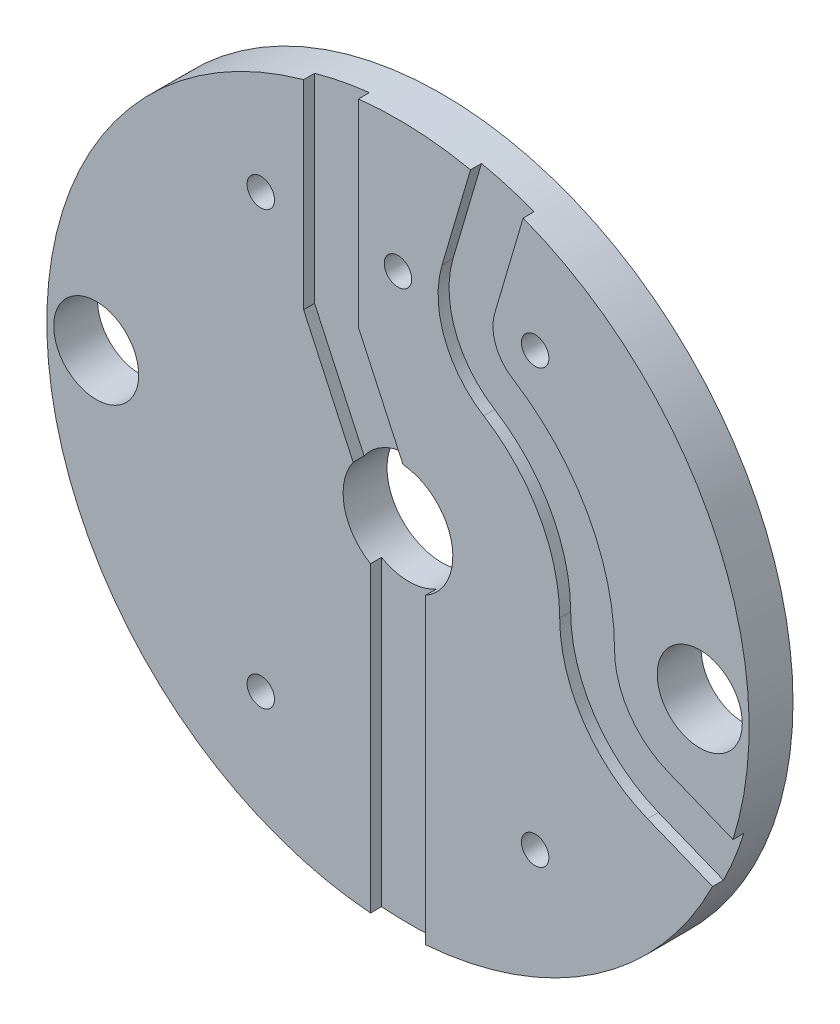
ISO-10303-21;
HEADER;
FILE_DESCRIPTION(('STEP AP214'),'2;1');
FILE_NAME('part.step','',(''),(''),'','','');
FILE_SCHEMA(('AUTOMOTIVE_DESIGN { 1 0 10303 214 1 1 1 1 }'));
ENDSEC;
DATA;
#1=APPLICATION_CONTEXT('core data for automotive mechanical design processes');
#2=APPLICATION_PROTOCOL_DEFINITION('international standard','automotive_design',2000,#1);
#3=PRODUCT_CONTEXT('',#1,'mechanical');
#4=PRODUCT('Part','Part','',(#3));
#5=PRODUCT_RELATED_PRODUCT_CATEGORY('part','',(#4));
#6=PRODUCT_DEFINITION_FORMATION('','',#4);
#7=PRODUCT_DEFINITION_CONTEXT('part definition',#1,'design');
#8=PRODUCT_DEFINITION('design','',#6,#7);
#9=PRODUCT_DEFINITION_SHAPE('','',#8);
#10=(LENGTH_UNIT() NAMED_UNIT(*) SI_UNIT(.MILLI.,.METRE.));
#11=(NAMED_UNIT(*) PLANE_ANGLE_UNIT() SI_UNIT($,.RADIAN.));
#12=(NAMED_UNIT(*) SI_UNIT($,.STERADIAN.) SOLID_ANGLE_UNIT());
#13=UNCERTAINTY_MEASURE_WITH_UNIT(LENGTH_MEASURE(1.E-05),#10,'distance_accuracy_value','');
#14=(GEOMETRIC_REPRESENTATION_CONTEXT(3) GLOBAL_UNCERTAINTY_ASSIGNED_CONTEXT((#13)) GLOBAL_UNIT_ASSIGNED_CONTEXT((#10,
#11,#12)) REPRESENTATION_CONTEXT('',''));
#15=CARTESIAN_POINT('',(0.,0.,0.));
#16=DIRECTION('',(0.,0.,1.));
#17=DIRECTION('',(1.,0.,0.));
#18=AXIS2_PLACEMENT_3D('',#15,#16,#17);
#19=CARTESIAN_POINT('',(0.,0.,1.6));
#20=DIRECTION('',(0.,0.,1.));
#21=DIRECTION('',(1.,0.,0.));
#22=AXIS2_PLACEMENT_3D('',#19,#20,#21);
#23=PLANE('',#22);
#24=DIRECTION('',(0.,1.,0.));
#25=VECTOR('',#24,1.);
#26=CARTESIAN_POINT('',(-1.43983257770259,13.2237994701737,1.6));
#27=LINE('',#26,#25);
#28=CARTESIAN_POINT('',(-1.43983257770259,5.50594076223502,1.6));
#29=VERTEX_POINT('',#28);
#30=CARTESIAN_POINT('',(-1.43983257770259,12.7187610303907,1.6));
#31=VERTEX_POINT('',#30);
#32=EDGE_CURVE('E191',#29,#31,#27,.T.);
#33=ORIENTED_EDGE('',*,*,#32,.F.);
#34=DIRECTION('',(-0.419058177461746,0.907959384500452,0.));
#35=VECTOR('',#34,1.);
#36=CARTESIAN_POINT('',(-1.43983257770259,5.50594076223502,1.6));
#37=LINE('',#36,#35);
#38=CARTESIAN_POINT('',(0.182129329809493,1.99168996262549,1.6));
#39=VERTEX_POINT('',#38);
#40=EDGE_CURVE('E223',#39,#29,#37,.T.);
#41=ORIENTED_EDGE('',*,*,#40,.F.);
#42=CARTESIAN_POINT('',(0.,0.,1.6));
#43=DIRECTION('',(0.,0.,1.));
#44=DIRECTION('',(1.,0.,0.));
#45=AXIS2_PLACEMENT_3D('',#42,#43,#44);
#46=CIRCLE('',#45,2.);
#47=CARTESIAN_POINT('',(1.,-1.73205080756888,1.6));
#48=VERTEX_POINT('',#47);
#49=EDGE_CURVE('E351',#48,#39,#46,.T.);
#50=ORIENTED_EDGE('',*,*,#49,.F.);
#51=DIRECTION('',(0.,1.,0.));
#52=VECTOR('',#51,1.);
#53=CARTESIAN_POINT('',(1.,0.219636843879393,1.6));
#54=LINE('',#53,#52);
#55=CARTESIAN_POINT('',(1.,-12.7608777127594,1.6));
#56=VERTEX_POINT('',#55);
#57=EDGE_CURVE('E221',#56,#48,#54,.T.);
#58=ORIENTED_EDGE('',*,*,#57,.F.);
#59=CARTESIAN_POINT('',(0.,0.,1.6));
#60=DIRECTION('',(0.,0.,1.));
#61=DIRECTION('',(1.,0.,0.));
#62=AXIS2_PLACEMENT_3D('',#59,#60,#61);
#63=CIRCLE('',#62,12.8);
#64=CARTESIAN_POINT('',(11.4659173471551,-5.68970468374301,1.6));
#65=VERTEX_POINT('',#64);
#66=EDGE_CURVE('E360',#56,#65,#63,.T.);
#67=ORIENTED_EDGE('',*,*,#66,.T.);
#68=DIRECTION('',(0.927764122408426,-0.37316716518435,0.));
#69=VECTOR('',#68,1.);
#70=CARTESIAN_POINT('',(9.09504176992669,-4.73608630511631,1.6));
#71=LINE('',#70,#69);
#72=CARTESIAN_POINT('',(9.09504176992669,-4.73608630511631,1.6));
#73=VERTEX_POINT('',#72);
#74=EDGE_CURVE('E274',#73,#65,#71,.T.);
#75=ORIENTED_EDGE('',*,*,#74,.F.);
#76=CARTESIAN_POINT('',(11.,0.,1.6));
#77=DIRECTION('',(0.,0.,1.));
#78=DIRECTION('',(1.,0.,0.));
#79=AXIS2_PLACEMENT_3D('',#76,#77,#78);
#80=CIRCLE('',#79,5.10483881702785);
#81=CARTESIAN_POINT('',(5.89516118297215,0.,1.6));
#82=VERTEX_POINT('',#81);
#83=EDGE_CURVE('E271',#82,#73,#80,.T.);
#84=ORIENTED_EDGE('',*,*,#83,.F.);
#85=CARTESIAN_POINT('',(0.,0.,1.6));
#86=DIRECTION('',(0.,0.,-1.));
#87=DIRECTION('',(1.,0.,0.));
#88=AXIS2_PLACEMENT_3D('',#85,#86,#87);
#89=CIRCLE('',#88,5.89516118297215);
#90=CARTESIAN_POINT('',(3.12472232230531,4.99890345793041,1.6));
#91=VERTEX_POINT('',#90);
#92=EDGE_CURVE('E268',#91,#82,#89,.T.);
#93=ORIENTED_EDGE('',*,*,#92,.F.);
#94=CARTESIAN_POINT('',(5.,7.99895629484671,1.6));
#95=DIRECTION('',(0.,0.,1.));
#96=DIRECTION('',(1.,0.,0.));
#97=AXIS2_PLACEMENT_3D('',#94,#95,#96);
#98=CIRCLE('',#97,3.53793490510348);
#99=CARTESIAN_POINT('',(1.60603137440553,8.9979359549149,1.6));
#100=VERTEX_POINT('',#99);
#101=EDGE_CURVE('E236',#100,#91,#98,.T.);
#102=ORIENTED_EDGE('',*,*,#101,.F.);
#103=DIRECTION('',(-0.282362363034764,-0.959307821265638,0.));
#104=VECTOR('',#103,1.);
#105=CARTESIAN_POINT('',(1.60603137440553,8.9979359549149,1.6));
#106=LINE('',#105,#104);
#107=CARTESIAN_POINT('',(2.64388376410676,12.5239721590992,1.6));
#108=VERTEX_POINT('',#107);
#109=EDGE_CURVE('E241',#108,#100,#106,.T.);
#110=ORIENTED_EDGE('',*,*,#109,.F.);
#111=EDGE_CURVE('E362',#108,#31,#63,.T.);
#112=ORIENTED_EDGE('',*,*,#111,.T.);
#113=EDGE_LOOP('',(#33,#41,#50,#58,#67,#75,#84,#93,#102,#110,#112));
#114=FACE_BOUND('',#113,.T.);
#115=CARTESIAN_POINT('',(5.,-7.7651663405088,1.6));
#116=DIRECTION('',(0.,0.,1.));
#117=DIRECTION('',(1.,0.,0.));
#118=AXIS2_PLACEMENT_3D('',#115,#116,#117);
#119=CIRCLE('',#118,0.500000000000001);
#120=CARTESIAN_POINT('',(5.5,-7.7651663405088,1.6));
#121=VERTEX_POINT('',#120);
#122=EDGE_CURVE('E330',#121,#121,#119,.T.);
#123=ORIENTED_EDGE('',*,*,#122,.F.);
#124=EDGE_LOOP('',(#123));
#125=FACE_BOUND('',#124,.T.);
#126=CARTESIAN_POINT('',(0.,7.99895629484671,1.6));
#127=DIRECTION('',(0.,0.,1.));
#128=DIRECTION('',(1.,0.,0.));
#129=AXIS2_PLACEMENT_3D('',#126,#127,#128);
#130=CIRCLE('',#129,0.5);
#131=CARTESIAN_POINT('',(0.5,7.99895629484671,1.6));
#132=VERTEX_POINT('',#131);
#133=EDGE_CURVE('E318',#132,#132,#130,.T.);
#134=ORIENTED_EDGE('',*,*,#133,.F.);
#135=EDGE_LOOP('',(#134));
#136=FACE_BOUND('',#135,.T.);
#137=ADVANCED_FACE('F37',(#114,#125,#136),#23,.T.);
#138=DIRECTION('',(0.282362363034764,0.959307821265638,0.));
#139=VECTOR('',#138,1.);
#140=CARTESIAN_POINT('',(3.52464701693681,8.43321122884537,1.6));
#141=LINE('',#140,#139);
#142=CARTESIAN_POINT('',(3.52464701693681,8.43321122884537,1.6));
#143=VERTEX_POINT('',#142);
#144=CARTESIAN_POINT('',(4.56249940663803,11.9592474330297,1.6));
#145=VERTEX_POINT('',#144);
#146=EDGE_CURVE('E288',#143,#145,#141,.T.);
#147=ORIENTED_EDGE('',*,*,#146,.F.);
#148=CARTESIAN_POINT('',(5.,7.99895629484671,1.6));
#149=DIRECTION('',(0.,0.,-1.));
#150=DIRECTION('',(1.,0.,0.));
#151=AXIS2_PLACEMENT_3D('',#148,#149,#150);
#152=CIRCLE('',#151,1.53793490510348);
#153=CARTESIAN_POINT('',(4.18481965478568,6.69483790408922,1.6));
#154=VERTEX_POINT('',#153);
#155=EDGE_CURVE('E285',#154,#143,#152,.T.);
#156=ORIENTED_EDGE('',*,*,#155,.F.);
#157=CARTESIAN_POINT('',(0.,0.,1.6));
#158=DIRECTION('',(0.,0.,1.));
#159=DIRECTION('',(1.,0.,0.));
#160=AXIS2_PLACEMENT_3D('',#157,#158,#159);
#161=CIRCLE('',#160,7.89516118297215);
#162=CARTESIAN_POINT('',(7.89516118297215,0.,1.6));
#163=VERTEX_POINT('',#162);
#164=EDGE_CURVE('E282',#163,#154,#161,.T.);
#165=ORIENTED_EDGE('',*,*,#164,.F.);
#166=CARTESIAN_POINT('',(11.,0.,1.6));
#167=DIRECTION('',(0.,0.,-1.));
#168=DIRECTION('',(1.,0.,0.));
#169=AXIS2_PLACEMENT_3D('',#166,#167,#168);
#170=CIRCLE('',#169,3.10483881702785);
#171=CARTESIAN_POINT('',(9.84137610029539,-2.88055806029946,1.6));
#172=VERTEX_POINT('',#171);
#173=EDGE_CURVE('E279',#172,#163,#170,.T.);
#174=ORIENTED_EDGE('',*,*,#173,.F.);
#175=DIRECTION('',(-0.927764122408426,0.37316716518435,0.));
#176=VECTOR('',#175,1.);
#177=CARTESIAN_POINT('',(9.84137610029539,-2.88055806029946,1.6));
#178=LINE('',#177,#176);
#179=CARTESIAN_POINT('',(12.2122516775238,-3.83417643892615,1.6));
#180=VERTEX_POINT('',#179);
#181=EDGE_CURVE('E277',#180,#172,#178,.T.);
#182=ORIENTED_EDGE('',*,*,#181,.F.);
#183=EDGE_CURVE('E357',#180,#145,#63,.T.);
#184=ORIENTED_EDGE('',*,*,#183,.T.);
#185=EDGE_LOOP('',(#147,#156,#165,#174,#182,#184));
#186=FACE_BOUND('',#185,.T.);
#187=CARTESIAN_POINT('',(11.,0.,1.6));
#188=DIRECTION('',(0.,0.,1.));
#189=DIRECTION('',(1.,0.,0.));
#190=AXIS2_PLACEMENT_3D('',#187,#188,#189);
#191=CIRCLE('',#190,1.55);
#192=CARTESIAN_POINT('',(12.55,0.,1.6));
#193=VERTEX_POINT('',#192);
#194=EDGE_CURVE('E339',#193,#193,#191,.T.);
#195=ORIENTED_EDGE('',*,*,#194,.F.);
#196=EDGE_LOOP('',(#195));
#197=FACE_BOUND('',#196,.T.);
#198=CARTESIAN_POINT('',(5.,7.99895629484671,1.6));
#199=DIRECTION('',(0.,0.,1.));
#200=DIRECTION('',(1.,0.,0.));
#201=AXIS2_PLACEMENT_3D('',#198,#199,#200);
#202=CIRCLE('',#201,0.5);
#203=CARTESIAN_POINT('',(5.5,7.99895629484671,1.6));
#204=VERTEX_POINT('',#203);
#205=EDGE_CURVE('E312',#204,#204,#202,.T.);
#206=ORIENTED_EDGE('',*,*,#205,.F.);
#207=EDGE_LOOP('',(#206));
#208=FACE_BOUND('',#207,.T.);
#209=ADVANCED_FACE('F468',(#186,#197,#208),#23,.T.);
#210=DIRECTION('',(0.,-1.,0.));
#211=VECTOR('',#210,1.);
#212=CARTESIAN_POINT('',(-1.,-0.21963684387939,1.6));
#213=LINE('',#212,#211);
#214=CARTESIAN_POINT('',(-1.,-1.73205080756888,1.6));
#215=VERTEX_POINT('',#214);
#216=CARTESIAN_POINT('',(-1.,-12.7608777127594,1.6));
#217=VERTEX_POINT('',#216);
#218=EDGE_CURVE('E219',#215,#217,#213,.T.);
#219=ORIENTED_EDGE('',*,*,#218,.F.);
#220=CARTESIAN_POINT('',(-1.63378943919141,1.153573607702,1.6));
#221=VERTEX_POINT('',#220);
#222=EDGE_CURVE('E354',#221,#215,#46,.T.);
#223=ORIENTED_EDGE('',*,*,#222,.F.);
#224=DIRECTION('',(0.419058177461746,-0.907959384500452,0.));
#225=VECTOR('',#224,1.);
#226=CARTESIAN_POINT('',(-3.43983257770259,5.06666707447623,1.6));
#227=LINE('',#226,#225);
#228=CARTESIAN_POINT('',(-3.43983257770259,5.06666707447623,1.6));
#229=VERTEX_POINT('',#228);
#230=EDGE_CURVE('E217',#229,#221,#227,.T.);
#231=ORIENTED_EDGE('',*,*,#230,.F.);
#232=DIRECTION('',(0.,-1.,0.));
#233=VECTOR('',#232,1.);
#234=CARTESIAN_POINT('',(-3.43983257770259,13.2237994701737,1.6));
#235=LINE('',#234,#233);
#236=CARTESIAN_POINT('',(-3.43983257770259,12.3291342695818,1.6));
#237=VERTEX_POINT('',#236);
#238=EDGE_CURVE('E197',#237,#229,#235,.T.);
#239=ORIENTED_EDGE('',*,*,#238,.F.);
#240=EDGE_CURVE('E404',#237,#217,#63,.T.);
#241=ORIENTED_EDGE('',*,*,#240,.T.);
#242=EDGE_LOOP('',(#219,#223,#231,#239,#241));
#243=FACE_BOUND('',#242,.T.);
#244=CARTESIAN_POINT('',(-5.,7.99895629484671,1.6));
#245=DIRECTION('',(0.,0.,1.));
#246=DIRECTION('',(1.,0.,0.));
#247=AXIS2_PLACEMENT_3D('',#244,#245,#246);
#248=CIRCLE('',#247,0.5);
#249=CARTESIAN_POINT('',(-4.5,7.99895629484671,1.6));
#250=VERTEX_POINT('',#249);
#251=EDGE_CURVE('E294',#250,#250,#248,.T.);
#252=ORIENTED_EDGE('',*,*,#251,.F.);
#253=EDGE_LOOP('',(#252));
#254=FACE_BOUND('',#253,.T.);
#255=CARTESIAN_POINT('',(-5.,-7.7651663405088,1.6));
#256=DIRECTION('',(0.,0.,1.));
#257=DIRECTION('',(1.,0.,0.));
#258=AXIS2_PLACEMENT_3D('',#255,#256,#257);
#259=CIRCLE('',#258,0.500000000000001);
#260=CARTESIAN_POINT('',(-4.5,-7.7651663405088,1.6));
#261=VERTEX_POINT('',#260);
#262=EDGE_CURVE('E324',#261,#261,#259,.T.);
#263=ORIENTED_EDGE('',*,*,#262,.F.);
#264=EDGE_LOOP('',(#263));
#265=FACE_BOUND('',#264,.T.);
#266=CARTESIAN_POINT('',(-11.,0.,1.6));
#267=DIRECTION('',(0.,0.,1.));
#268=DIRECTION('',(1.,0.,0.));
#269=AXIS2_PLACEMENT_3D('',#266,#267,#268);
#270=CIRCLE('',#269,1.55);
#271=CARTESIAN_POINT('',(-9.45,0.,1.6));
#272=VERTEX_POINT('',#271);
#273=EDGE_CURVE('E345',#272,#272,#270,.T.);
#274=ORIENTED_EDGE('',*,*,#273,.F.);
#275=EDGE_LOOP('',(#274));
#276=FACE_BOUND('',#275,.T.);
#277=ADVANCED_FACE('F470',(#243,#254,#265,#276),#23,.T.);
#278=CARTESIAN_POINT('',(0.,0.,0.));
#279=DIRECTION('',(0.,0.,1.));
#280=DIRECTION('',(1.,0.,0.));
#281=AXIS2_PLACEMENT_3D('',#278,#279,#280);
#282=PLANE('',#281);
#283=CARTESIAN_POINT('',(-5.,7.99895629484671,0.));
#284=DIRECTION('',(0.,0.,1.));
#285=DIRECTION('',(1.,0.,0.));
#286=AXIS2_PLACEMENT_3D('',#283,#284,#285);
#287=CIRCLE('',#286,0.5);
#288=CARTESIAN_POINT('',(-4.5,7.99895629484671,0.));
#289=VERTEX_POINT('',#288);
#290=EDGE_CURVE('E309',#289,#289,#287,.T.);
#291=ORIENTED_EDGE('',*,*,#290,.T.);
#292=EDGE_LOOP('',(#291));
#293=FACE_BOUND('',#292,.T.);
#294=CARTESIAN_POINT('',(5.,7.99895629484671,0.));
#295=DIRECTION('',(0.,0.,1.));
#296=DIRECTION('',(1.,0.,0.));
#297=AXIS2_PLACEMENT_3D('',#294,#295,#296);
#298=CIRCLE('',#297,0.5);
#299=CARTESIAN_POINT('',(5.5,7.99895629484671,0.));
#300=VERTEX_POINT('',#299);
#301=EDGE_CURVE('E315',#300,#300,#298,.T.);
#302=ORIENTED_EDGE('',*,*,#301,.T.);
#303=EDGE_LOOP('',(#302));
#304=FACE_BOUND('',#303,.T.);
#305=CARTESIAN_POINT('',(0.,7.99895629484671,0.));
#306=DIRECTION('',(0.,0.,1.));
#307=DIRECTION('',(1.,0.,0.));
#308=AXIS2_PLACEMENT_3D('',#305,#306,#307);
#309=CIRCLE('',#308,0.5);
#310=CARTESIAN_POINT('',(0.5,7.99895629484671,0.));
#311=VERTEX_POINT('',#310);
#312=EDGE_CURVE('E321',#311,#311,#309,.T.);
#313=ORIENTED_EDGE('',*,*,#312,.T.);
#314=EDGE_LOOP('',(#313));
#315=FACE_BOUND('',#314,.T.);
#316=CARTESIAN_POINT('',(-5.,-7.7651663405088,0.));
#317=DIRECTION('',(0.,0.,1.));
#318=DIRECTION('',(1.,0.,0.));
#319=AXIS2_PLACEMENT_3D('',#316,#317,#318);
#320=CIRCLE('',#319,0.500000000000001);
#321=CARTESIAN_POINT('',(-4.5,-7.7651663405088,0.));
#322=VERTEX_POINT('',#321);
#323=EDGE_CURVE('E327',#322,#322,#320,.T.);
#324=ORIENTED_EDGE('',*,*,#323,.T.);
#325=EDGE_LOOP('',(#324));
#326=FACE_BOUND('',#325,.T.);
#327=CARTESIAN_POINT('',(5.,-7.7651663405088,0.));
#328=DIRECTION('',(0.,0.,1.));
#329=DIRECTION('',(1.,0.,0.));
#330=AXIS2_PLACEMENT_3D('',#327,#328,#329);
#331=CIRCLE('',#330,0.500000000000001);
#332=CARTESIAN_POINT('',(5.5,-7.7651663405088,0.));
#333=VERTEX_POINT('',#332);
#334=EDGE_CURVE('E333',#333,#333,#331,.T.);
#335=ORIENTED_EDGE('',*,*,#334,.T.);
#336=EDGE_LOOP('',(#335));
#337=FACE_BOUND('',#336,.T.);
#338=CARTESIAN_POINT('',(-11.,0.,0.));
#339=DIRECTION('',(0.,0.,1.));
#340=DIRECTION('',(1.,0.,0.));
#341=AXIS2_PLACEMENT_3D('',#338,#339,#340);
#342=CIRCLE('',#341,1.55);
#343=CARTESIAN_POINT('',(-9.45,0.,0.));
#344=VERTEX_POINT('',#343);
#345=EDGE_CURVE('E342',#344,#344,#342,.T.);
#346=ORIENTED_EDGE('',*,*,#345,.T.);
#347=EDGE_LOOP('',(#346));
#348=FACE_BOUND('',#347,.T.);
#349=CARTESIAN_POINT('',(0.,0.,0.));
#350=DIRECTION('',(0.,0.,1.));
#351=DIRECTION('',(1.,0.,0.));
#352=AXIS2_PLACEMENT_3D('',#349,#350,#351);
#353=CIRCLE('',#352,12.8);
#354=CARTESIAN_POINT('',(12.8,0.,0.));
#355=VERTEX_POINT('',#354);
#356=EDGE_CURVE('E361',#355,#355,#353,.T.);
#357=ORIENTED_EDGE('',*,*,#356,.F.);
#358=EDGE_LOOP('',(#357));
#359=FACE_BOUND('',#358,.T.);
#360=CARTESIAN_POINT('',(0.,0.,0.));
#361=DIRECTION('',(0.,0.,1.));
#362=DIRECTION('',(1.,0.,0.));
#363=AXIS2_PLACEMENT_3D('',#360,#361,#362);
#364=CIRCLE('',#363,2.);
#365=CARTESIAN_POINT('',(2.,0.,0.));
#366=VERTEX_POINT('',#365);
#367=EDGE_CURVE('E348',#366,#366,#364,.T.);
#368=ORIENTED_EDGE('',*,*,#367,.T.);
#369=EDGE_LOOP('',(#368));
#370=FACE_BOUND('',#369,.T.);
#371=CARTESIAN_POINT('',(11.,0.,0.));
#372=DIRECTION('',(0.,0.,1.));
#373=DIRECTION('',(1.,0.,0.));
#374=AXIS2_PLACEMENT_3D('',#371,#372,#373);
#375=CIRCLE('',#374,1.55);
#376=CARTESIAN_POINT('',(12.55,0.,0.));
#377=VERTEX_POINT('',#376);
#378=EDGE_CURVE('E336',#377,#377,#375,.T.);
#379=ORIENTED_EDGE('',*,*,#378,.T.);
#380=EDGE_LOOP('',(#379));
#381=FACE_BOUND('',#380,.T.);
#382=ADVANCED_FACE('F477',(#293,#304,#315,#326,#337,#348,#359,#370,#381),#282,.F.);
#383=CARTESIAN_POINT('',(0.,0.,1.6));
#384=DIRECTION('',(0.,0.,-1.));
#385=DIRECTION('',(-1.,0.,0.));
#386=AXIS2_PLACEMENT_3D('',#383,#384,#385);
#387=CYLINDRICAL_SURFACE('',#386,12.8);
#388=ORIENTED_EDGE('',*,*,#240,.F.);
#389=DIRECTION('',(0.,0.,-1.));
#390=VECTOR('',#389,1.);
#391=CARTESIAN_POINT('',(-3.43983257770259,12.3291342695818,1.6));
#392=LINE('',#391,#390);
#393=CARTESIAN_POINT('',(-3.43983257770259,12.3291342695818,1.2));
#394=VERTEX_POINT('',#393);
#395=EDGE_CURVE('E11',#237,#394,#392,.T.);
#396=ORIENTED_EDGE('',*,*,#395,.T.);
#397=CARTESIAN_POINT('',(0.,0.,1.2));
#398=DIRECTION('',(0.,0.,1.));
#399=DIRECTION('',(1.,0.,0.));
#400=AXIS2_PLACEMENT_3D('',#397,#398,#399);
#401=CIRCLE('',#400,12.8);
#402=CARTESIAN_POINT('',(-1.43983257770259,12.7187610303907,1.2));
#403=VERTEX_POINT('',#402);
#404=EDGE_CURVE('E189',#403,#394,#401,.T.);
#405=ORIENTED_EDGE('',*,*,#404,.F.);
#406=DIRECTION('',(0.,0.,-1.));
#407=VECTOR('',#406,1.);
#408=CARTESIAN_POINT('',(-1.43983257770259,12.7187610303907,1.6));
#409=LINE('',#408,#407);
#410=EDGE_CURVE('E45',#403,#31,#409,.F.);
#411=ORIENTED_EDGE('',*,*,#410,.T.);
#412=ORIENTED_EDGE('',*,*,#111,.F.);
#413=DIRECTION('',(0.,0.,-1.));
#414=VECTOR('',#413,1.);
#415=CARTESIAN_POINT('',(2.64388376410676,12.5239721590992,1.6));
#416=LINE('',#415,#414);
#417=CARTESIAN_POINT('',(2.64388376410676,12.5239721590992,1.2));
#418=VERTEX_POINT('',#417);
#419=EDGE_CURVE('E377',#108,#418,#416,.T.);
#420=ORIENTED_EDGE('',*,*,#419,.T.);
#421=CARTESIAN_POINT('',(0.,0.,1.2));
#422=DIRECTION('',(0.,0.,1.));
#423=DIRECTION('',(1.,0.,0.));
#424=AXIS2_PLACEMENT_3D('',#421,#422,#423);
#425=CIRCLE('',#424,12.8);
#426=CARTESIAN_POINT('',(4.56249940663803,11.9592474330297,1.2));
#427=VERTEX_POINT('',#426);
#428=EDGE_CURVE('E368',#427,#418,#425,.T.);
#429=ORIENTED_EDGE('',*,*,#428,.F.);
#430=DIRECTION('',(0.,0.,-1.));
#431=VECTOR('',#430,1.);
#432=CARTESIAN_POINT('',(4.56249940663803,11.9592474330297,1.6));
#433=LINE('',#432,#431);
#434=EDGE_CURVE('E374',#427,#145,#433,.F.);
#435=ORIENTED_EDGE('',*,*,#434,.T.);
#436=ORIENTED_EDGE('',*,*,#183,.F.);
#437=DIRECTION('',(0.,0.,-1.));
#438=VECTOR('',#437,1.);
#439=CARTESIAN_POINT('',(12.2122516775238,-3.83417643892615,1.6));
#440=LINE('',#439,#438);
#441=CARTESIAN_POINT('',(12.2122516775238,-3.83417643892615,1.2));
#442=VERTEX_POINT('',#441);
#443=EDGE_CURVE('E371',#180,#442,#440,.T.);
#444=ORIENTED_EDGE('',*,*,#443,.T.);
#445=CARTESIAN_POINT('',(11.4659173471551,-5.68970468374301,1.2));
#446=VERTEX_POINT('',#445);
#447=EDGE_CURVE('E365',#446,#442,#425,.T.);
#448=ORIENTED_EDGE('',*,*,#447,.F.);
#449=DIRECTION('',(0.,0.,-1.));
#450=VECTOR('',#449,1.);
#451=CARTESIAN_POINT('',(11.4659173471551,-5.68970468374301,1.6));
#452=LINE('',#451,#450);
#453=EDGE_CURVE('E367',#446,#65,#452,.F.);
#454=ORIENTED_EDGE('',*,*,#453,.T.);
#455=ORIENTED_EDGE('',*,*,#66,.F.);
#456=DIRECTION('',(0.,0.,-1.));
#457=VECTOR('',#456,1.);
#458=CARTESIAN_POINT('',(1.,-12.7608777127594,1.6));
#459=LINE('',#458,#457);
#460=CARTESIAN_POINT('',(1.,-12.7608777127594,1.2));
#461=VERTEX_POINT('',#460);
#462=EDGE_CURVE('E233',#56,#461,#459,.T.);
#463=ORIENTED_EDGE('',*,*,#462,.T.);
#464=CARTESIAN_POINT('',(-1.,-12.7608777127594,1.2));
#465=VERTEX_POINT('',#464);
#466=EDGE_CURVE('E227',#465,#461,#401,.T.);
#467=ORIENTED_EDGE('',*,*,#466,.F.);
#468=DIRECTION('',(0.,0.,-1.));
#469=VECTOR('',#468,1.);
#470=CARTESIAN_POINT('',(-1.,-12.7608777127594,1.6));
#471=LINE('',#470,#469);
#472=EDGE_CURVE('E230',#465,#217,#471,.F.);
#473=ORIENTED_EDGE('',*,*,#472,.T.);
#474=EDGE_LOOP('',(#388,#396,#405,#411,#412,#420,#429,#435,#436,#444,#448,#454,#455,#463,#467,#473));
#475=FACE_BOUND('',#474,.T.);
#476=ORIENTED_EDGE('',*,*,#356,.T.);
#477=EDGE_LOOP('',(#476));
#478=FACE_BOUND('',#477,.T.);
#479=ADVANCED_FACE('F39',(#475,#478),#387,.T.);
#480=CARTESIAN_POINT('',(0.,0.,1.6));
#481=DIRECTION('',(0.,0.,-1.));
#482=DIRECTION('',(-1.,0.,0.));
#483=AXIS2_PLACEMENT_3D('',#480,#481,#482);
#484=CYLINDRICAL_SURFACE('',#483,2.);
#485=DIRECTION('',(0.,0.,-1.));
#486=VECTOR('',#485,1.);
#487=CARTESIAN_POINT('',(0.182129329809493,1.99168996262549,1.6));
#488=LINE('',#487,#486);
#489=CARTESIAN_POINT('',(0.182129329809493,1.99168996262549,1.2));
#490=VERTEX_POINT('',#489);
#491=EDGE_CURVE('E389',#490,#39,#488,.F.);
#492=ORIENTED_EDGE('',*,*,#491,.F.);
#493=CARTESIAN_POINT('',(0.,0.,1.2));
#494=DIRECTION('',(0.,0.,1.));
#495=DIRECTION('',(1.,0.,0.));
#496=AXIS2_PLACEMENT_3D('',#493,#494,#495);
#497=CIRCLE('',#496,2.);
#498=CARTESIAN_POINT('',(-1.63378943919141,1.153573607702,1.2));
#499=VERTEX_POINT('',#498);
#500=EDGE_CURVE('E384',#490,#499,#497,.T.);
#501=ORIENTED_EDGE('',*,*,#500,.T.);
#502=DIRECTION('',(0.,0.,-1.));
#503=VECTOR('',#502,1.);
#504=CARTESIAN_POINT('',(-1.63378943919141,1.153573607702,1.6));
#505=LINE('',#504,#503);
#506=EDGE_CURVE('E205',#221,#499,#505,.T.);
#507=ORIENTED_EDGE('',*,*,#506,.F.);
#508=ORIENTED_EDGE('',*,*,#222,.T.);
#509=DIRECTION('',(0.,0.,-1.));
#510=VECTOR('',#509,1.);
#511=CARTESIAN_POINT('',(-1.,-1.73205080756888,1.6));
#512=LINE('',#511,#510);
#513=CARTESIAN_POINT('',(-1.,-1.73205080756888,1.2));
#514=VERTEX_POINT('',#513);
#515=EDGE_CURVE('E383',#514,#215,#512,.F.);
#516=ORIENTED_EDGE('',*,*,#515,.F.);
#517=CARTESIAN_POINT('',(1.,-1.73205080756888,1.2));
#518=VERTEX_POINT('',#517);
#519=EDGE_CURVE('E380',#514,#518,#497,.T.);
#520=ORIENTED_EDGE('',*,*,#519,.T.);
#521=DIRECTION('',(0.,0.,-1.));
#522=VECTOR('',#521,1.);
#523=CARTESIAN_POINT('',(1.,-1.73205080756888,1.6));
#524=LINE('',#523,#522);
#525=EDGE_CURVE('E386',#48,#518,#524,.T.);
#526=ORIENTED_EDGE('',*,*,#525,.F.);
#527=ORIENTED_EDGE('',*,*,#49,.T.);
#528=EDGE_LOOP('',(#492,#501,#507,#508,#516,#520,#526,#527));
#529=FACE_BOUND('',#528,.T.);
#530=ORIENTED_EDGE('',*,*,#367,.F.);
#531=EDGE_LOOP('',(#530));
#532=FACE_BOUND('',#531,.T.);
#533=ADVANCED_FACE('F495',(#529,#532),#484,.F.);
#534=CARTESIAN_POINT('',(-11.,0.,1.6));
#535=DIRECTION('',(0.,0.,-1.));
#536=DIRECTION('',(-1.,0.,0.));
#537=AXIS2_PLACEMENT_3D('',#534,#535,#536);
#538=CYLINDRICAL_SURFACE('',#537,1.55);
#539=ORIENTED_EDGE('',*,*,#273,.T.);
#540=EDGE_LOOP('',(#539));
#541=FACE_BOUND('',#540,.T.);
#542=ORIENTED_EDGE('',*,*,#345,.F.);
#543=EDGE_LOOP('',(#542));
#544=FACE_BOUND('',#543,.T.);
#545=ADVANCED_FACE('F491',(#541,#544),#538,.F.);
#546=CARTESIAN_POINT('',(11.,0.,1.6));
#547=DIRECTION('',(0.,0.,-1.));
#548=DIRECTION('',(-1.,0.,0.));
#549=AXIS2_PLACEMENT_3D('',#546,#547,#548);
#550=CYLINDRICAL_SURFACE('',#549,1.55);
#551=ORIENTED_EDGE('',*,*,#194,.T.);
#552=EDGE_LOOP('',(#551));
#553=FACE_BOUND('',#552,.T.);
#554=ORIENTED_EDGE('',*,*,#378,.F.);
#555=EDGE_LOOP('',(#554));
#556=FACE_BOUND('',#555,.T.);
#557=ADVANCED_FACE('F494',(#553,#556),#550,.F.);
#558=CARTESIAN_POINT('',(5.,-7.7651663405088,0.));
#559=DIRECTION('',(0.,0.,1.));
#560=DIRECTION('',(1.,0.,0.));
#561=AXIS2_PLACEMENT_3D('',#558,#559,#560);
#562=CYLINDRICAL_SURFACE('',#561,0.500000000000001);
#563=ORIENTED_EDGE('',*,*,#334,.F.);
#564=EDGE_LOOP('',(#563));
#565=FACE_BOUND('',#564,.T.);
#566=ORIENTED_EDGE('',*,*,#122,.T.);
#567=EDGE_LOOP('',(#566));
#568=FACE_BOUND('',#567,.T.);
#569=ADVANCED_FACE('F507',(#565,#568),#562,.F.);
#570=CARTESIAN_POINT('',(-5.,-7.7651663405088,0.));
#571=DIRECTION('',(0.,0.,1.));
#572=DIRECTION('',(1.,0.,0.));
#573=AXIS2_PLACEMENT_3D('',#570,#571,#572);
#574=CYLINDRICAL_SURFACE('',#573,0.500000000000001);
#575=ORIENTED_EDGE('',*,*,#323,.F.);
#576=EDGE_LOOP('',(#575));
#577=FACE_BOUND('',#576,.T.);
#578=ORIENTED_EDGE('',*,*,#262,.T.);
#579=EDGE_LOOP('',(#578));
#580=FACE_BOUND('',#579,.T.);
#581=ADVANCED_FACE('F513',(#577,#580),#574,.F.);
#582=CARTESIAN_POINT('',(0.,7.99895629484671,0.));
#583=DIRECTION('',(0.,0.,1.));
#584=DIRECTION('',(1.,0.,0.));
#585=AXIS2_PLACEMENT_3D('',#582,#583,#584);
#586=CYLINDRICAL_SURFACE('',#585,0.5);
#587=ORIENTED_EDGE('',*,*,#312,.F.);
#588=EDGE_LOOP('',(#587));
#589=FACE_BOUND('',#588,.T.);
#590=ORIENTED_EDGE('',*,*,#133,.T.);
#591=EDGE_LOOP('',(#590));
#592=FACE_BOUND('',#591,.T.);
#593=ADVANCED_FACE('F704',(#589,#592),#586,.F.);
#594=CARTESIAN_POINT('',(5.,7.99895629484671,0.));
#595=DIRECTION('',(0.,0.,1.));
#596=DIRECTION('',(1.,0.,0.));
#597=AXIS2_PLACEMENT_3D('',#594,#595,#596);
#598=CYLINDRICAL_SURFACE('',#597,0.5);
#599=ORIENTED_EDGE('',*,*,#301,.F.);
#600=EDGE_LOOP('',(#599));
#601=FACE_BOUND('',#600,.T.);
#602=ORIENTED_EDGE('',*,*,#205,.T.);
#603=EDGE_LOOP('',(#602));
#604=FACE_BOUND('',#603,.T.);
#605=ADVANCED_FACE('F695',(#601,#604),#598,.F.);
#606=CARTESIAN_POINT('',(-5.,7.99895629484671,0.));
#607=DIRECTION('',(0.,0.,1.));
#608=DIRECTION('',(1.,0.,0.));
#609=AXIS2_PLACEMENT_3D('',#606,#607,#608);
#610=CYLINDRICAL_SURFACE('',#609,0.5);
#611=ORIENTED_EDGE('',*,*,#290,.F.);
#612=EDGE_LOOP('',(#611));
#613=FACE_BOUND('',#612,.T.);
#614=ORIENTED_EDGE('',*,*,#251,.T.);
#615=EDGE_LOOP('',(#614));
#616=FACE_BOUND('',#615,.T.);
#617=ADVANCED_FACE('F555',(#613,#616),#610,.F.);
#618=CARTESIAN_POINT('',(1.60603137440553,8.9979359549149,1.2));
#619=DIRECTION('',(-0.959307821265638,0.282362363034764,0.));
#620=DIRECTION('',(-0.282362363034764,-0.959307821265638,0.));
#621=AXIS2_PLACEMENT_3D('',#618,#619,#620);
#622=PLANE('',#621);
#623=ORIENTED_EDGE('',*,*,#109,.T.);
#624=DIRECTION('',(0.,0.,1.));
#625=VECTOR('',#624,1.);
#626=CARTESIAN_POINT('',(1.60603137440553,8.9979359549149,1.2));
#627=LINE('',#626,#625);
#628=CARTESIAN_POINT('',(1.60603137440553,8.9979359549149,1.2));
#629=VERTEX_POINT('',#628);
#630=EDGE_CURVE('E291',#629,#100,#627,.T.);
#631=ORIENTED_EDGE('',*,*,#630,.F.);
#632=DIRECTION('',(-0.282362363034764,-0.959307821265638,0.));
#633=VECTOR('',#632,1.);
#634=CARTESIAN_POINT('',(1.60603137440553,8.9979359549149,1.2));
#635=LINE('',#634,#633);
#636=EDGE_CURVE('E263',#418,#629,#635,.T.);
#637=ORIENTED_EDGE('',*,*,#636,.F.);
#638=ORIENTED_EDGE('',*,*,#419,.F.);
#639=EDGE_LOOP('',(#623,#631,#637,#638));
#640=FACE_BOUND('',#639,.T.);
#641=ADVANCED_FACE('F445',(#640),#622,.F.);
#642=CARTESIAN_POINT('',(3.52464701693681,8.43321122884537,1.2));
#643=DIRECTION('',(0.959307821265638,-0.282362363034764,0.));
#644=DIRECTION('',(0.282362363034764,0.959307821265638,0.));
#645=AXIS2_PLACEMENT_3D('',#642,#643,#644);
#646=PLANE('',#645);
#647=DIRECTION('',(0.282362363034764,0.959307821265638,0.));
#648=VECTOR('',#647,1.);
#649=CARTESIAN_POINT('',(3.52464701693681,8.43321122884537,1.2));
#650=LINE('',#649,#648);
#651=CARTESIAN_POINT('',(3.52464701693681,8.43321122884537,1.2));
#652=VERTEX_POINT('',#651);
#653=EDGE_CURVE('E260',#652,#427,#650,.T.);
#654=ORIENTED_EDGE('',*,*,#653,.F.);
#655=DIRECTION('',(0.,0.,1.));
#656=VECTOR('',#655,1.);
#657=CARTESIAN_POINT('',(3.52464701693681,8.43321122884537,1.2));
#658=LINE('',#657,#656);
#659=EDGE_CURVE('E295',#652,#143,#658,.T.);
#660=ORIENTED_EDGE('',*,*,#659,.T.);
#661=ORIENTED_EDGE('',*,*,#146,.T.);
#662=ORIENTED_EDGE('',*,*,#434,.F.);
#663=EDGE_LOOP('',(#654,#660,#661,#662));
#664=FACE_BOUND('',#663,.T.);
#665=ADVANCED_FACE('F441',(#664),#646,.F.);
#666=CARTESIAN_POINT('',(9.84137610029539,-2.88055806029946,1.2));
#667=DIRECTION('',(0.37316716518435,0.927764122408426,0.));
#668=DIRECTION('',(-0.927764122408426,0.37316716518435,0.));
#669=AXIS2_PLACEMENT_3D('',#666,#667,#668);
#670=PLANE('',#669);
#671=ORIENTED_EDGE('',*,*,#181,.T.);
#672=DIRECTION('',(0.,0.,1.));
#673=VECTOR('',#672,1.);
#674=CARTESIAN_POINT('',(9.84137610029539,-2.88055806029946,1.2));
#675=LINE('',#674,#673);
#676=CARTESIAN_POINT('',(9.84137610029539,-2.88055806029946,1.2));
#677=VERTEX_POINT('',#676);
#678=EDGE_CURVE('E301',#677,#172,#675,.T.);
#679=ORIENTED_EDGE('',*,*,#678,.F.);
#680=DIRECTION('',(-0.927764122408426,0.37316716518435,0.));
#681=VECTOR('',#680,1.);
#682=CARTESIAN_POINT('',(9.84137610029539,-2.88055806029946,1.2));
#683=LINE('',#682,#681);
#684=EDGE_CURVE('E249',#442,#677,#683,.T.);
#685=ORIENTED_EDGE('',*,*,#684,.F.);
#686=ORIENTED_EDGE('',*,*,#443,.F.);
#687=EDGE_LOOP('',(#671,#679,#685,#686));
#688=FACE_BOUND('',#687,.T.);
#689=ADVANCED_FACE('F424',(#688),#670,.F.);
#690=CARTESIAN_POINT('',(9.09504176992669,-4.73608630511631,1.2));
#691=DIRECTION('',(-0.37316716518435,-0.927764122408426,0.));
#692=DIRECTION('',(0.927764122408426,-0.37316716518435,0.));
#693=AXIS2_PLACEMENT_3D('',#690,#691,#692);
#694=PLANE('',#693);
#695=DIRECTION('',(0.927764122408426,-0.37316716518435,0.));
#696=VECTOR('',#695,1.);
#697=CARTESIAN_POINT('',(9.09504176992669,-4.73608630511631,1.2));
#698=LINE('',#697,#696);
#699=CARTESIAN_POINT('',(9.09504176992669,-4.73608630511631,1.2));
#700=VERTEX_POINT('',#699);
#701=EDGE_CURVE('E247',#700,#446,#698,.T.);
#702=ORIENTED_EDGE('',*,*,#701,.F.);
#703=DIRECTION('',(0.,0.,1.));
#704=VECTOR('',#703,1.);
#705=CARTESIAN_POINT('',(9.09504176992669,-4.73608630511631,1.2));
#706=LINE('',#705,#704);
#707=EDGE_CURVE('E304',#700,#73,#706,.T.);
#708=ORIENTED_EDGE('',*,*,#707,.T.);
#709=ORIENTED_EDGE('',*,*,#74,.T.);
#710=ORIENTED_EDGE('',*,*,#453,.F.);
#711=EDGE_LOOP('',(#702,#708,#709,#710));
#712=FACE_BOUND('',#711,.T.);
#713=ADVANCED_FACE('F416',(#712),#694,.F.);
#714=CARTESIAN_POINT('',(5.,7.99895629484671,1.2));
#715=DIRECTION('',(0.,0.,1.));
#716=DIRECTION('',(1.,0.,0.));
#717=AXIS2_PLACEMENT_3D('',#714,#715,#716);
#718=PLANE('',#717);
#719=ORIENTED_EDGE('',*,*,#428,.T.);
#720=ORIENTED_EDGE('',*,*,#636,.T.);
#721=CARTESIAN_POINT('',(5.,7.99895629484671,1.2));
#722=DIRECTION('',(0.,0.,1.));
#723=DIRECTION('',(1.,0.,0.));
#724=AXIS2_PLACEMENT_3D('',#721,#722,#723);
#725=CIRCLE('',#724,3.53793490510348);
#726=CARTESIAN_POINT('',(3.12472232230531,4.99890345793041,1.2));
#727=VERTEX_POINT('',#726);
#728=EDGE_CURVE('E237',#629,#727,#725,.T.);
#729=ORIENTED_EDGE('',*,*,#728,.T.);
#730=CARTESIAN_POINT('',(0.,0.,1.2));
#731=DIRECTION('',(0.,0.,-1.));
#732=DIRECTION('',(1.,0.,0.));
#733=AXIS2_PLACEMENT_3D('',#730,#731,#732);
#734=CIRCLE('',#733,5.89516118297215);
#735=CARTESIAN_POINT('',(5.89516118297215,0.,1.2));
#736=VERTEX_POINT('',#735);
#737=EDGE_CURVE('E240',#727,#736,#734,.T.);
#738=ORIENTED_EDGE('',*,*,#737,.T.);
#739=CARTESIAN_POINT('',(11.,0.,1.2));
#740=DIRECTION('',(0.,0.,1.));
#741=DIRECTION('',(1.,0.,0.));
#742=AXIS2_PLACEMENT_3D('',#739,#740,#741);
#743=CIRCLE('',#742,5.10483881702785);
#744=EDGE_CURVE('E244',#736,#700,#743,.T.);
#745=ORIENTED_EDGE('',*,*,#744,.T.);
#746=ORIENTED_EDGE('',*,*,#701,.T.);
#747=ORIENTED_EDGE('',*,*,#447,.T.);
#748=ORIENTED_EDGE('',*,*,#684,.T.);
#749=CARTESIAN_POINT('',(11.,0.,1.2));
#750=DIRECTION('',(0.,0.,-1.));
#751=DIRECTION('',(1.,0.,0.));
#752=AXIS2_PLACEMENT_3D('',#749,#750,#751);
#753=CIRCLE('',#752,3.10483881702785);
#754=CARTESIAN_POINT('',(7.89516118297215,0.,1.2));
#755=VERTEX_POINT('',#754);
#756=EDGE_CURVE('E251',#677,#755,#753,.T.);
#757=ORIENTED_EDGE('',*,*,#756,.T.);
#758=CARTESIAN_POINT('',(0.,0.,1.2));
#759=DIRECTION('',(0.,0.,1.));
#760=DIRECTION('',(1.,0.,0.));
#761=AXIS2_PLACEMENT_3D('',#758,#759,#760);
#762=CIRCLE('',#761,7.89516118297215);
#763=CARTESIAN_POINT('',(4.18481965478568,6.69483790408922,1.2));
#764=VERTEX_POINT('',#763);
#765=EDGE_CURVE('E254',#755,#764,#762,.T.);
#766=ORIENTED_EDGE('',*,*,#765,.T.);
#767=CARTESIAN_POINT('',(5.,7.99895629484671,1.2));
#768=DIRECTION('',(0.,0.,-1.));
#769=DIRECTION('',(1.,0.,0.));
#770=AXIS2_PLACEMENT_3D('',#767,#768,#769);
#771=CIRCLE('',#770,1.53793490510348);
#772=EDGE_CURVE('E257',#764,#652,#771,.T.);
#773=ORIENTED_EDGE('',*,*,#772,.T.);
#774=ORIENTED_EDGE('',*,*,#653,.T.);
#775=EDGE_LOOP('',(#719,#720,#729,#738,#745,#746,#747,#748,#757,#766,#773,#774));
#776=FACE_BOUND('',#775,.T.);
#777=ADVANCED_FACE('F421',(#776),#718,.T.);
#778=CARTESIAN_POINT('',(5.,7.99895629484671,1.2));
#779=DIRECTION('',(0.,0.,1.));
#780=DIRECTION('',(1.,0.,0.));
#781=AXIS2_PLACEMENT_3D('',#778,#779,#780);
#782=CYLINDRICAL_SURFACE('',#781,3.53793490510348);
#783=ORIENTED_EDGE('',*,*,#101,.T.);
#784=DIRECTION('',(0.,0.,1.));
#785=VECTOR('',#784,1.);
#786=CARTESIAN_POINT('',(3.12472232230531,4.99890345793041,1.2));
#787=LINE('',#786,#785);
#788=EDGE_CURVE('E265',#727,#91,#787,.T.);
#789=ORIENTED_EDGE('',*,*,#788,.F.);
#790=ORIENTED_EDGE('',*,*,#728,.F.);
#791=ORIENTED_EDGE('',*,*,#630,.T.);
#792=EDGE_LOOP('',(#783,#789,#790,#791));
#793=FACE_BOUND('',#792,.T.);
#794=ADVANCED_FACE('F450',(#793),#782,.F.);
#795=CARTESIAN_POINT('',(5.,7.99895629484671,1.2));
#796=DIRECTION('',(0.,0.,1.));
#797=DIRECTION('',(1.,0.,0.));
#798=AXIS2_PLACEMENT_3D('',#795,#796,#797);
#799=CYLINDRICAL_SURFACE('',#798,1.53793490510348);
#800=ORIENTED_EDGE('',*,*,#155,.T.);
#801=ORIENTED_EDGE('',*,*,#659,.F.);
#802=ORIENTED_EDGE('',*,*,#772,.F.);
#803=DIRECTION('',(0.,0.,1.));
#804=VECTOR('',#803,1.);
#805=CARTESIAN_POINT('',(4.18481965478568,6.69483790408922,1.2));
#806=LINE('',#805,#804);
#807=EDGE_CURVE('E297',#764,#154,#806,.T.);
#808=ORIENTED_EDGE('',*,*,#807,.T.);
#809=EDGE_LOOP('',(#800,#801,#802,#808));
#810=FACE_BOUND('',#809,.T.);
#811=ADVANCED_FACE('F437',(#810),#799,.T.);
#812=CARTESIAN_POINT('',(0.,0.,1.2));
#813=DIRECTION('',(0.,0.,1.));
#814=DIRECTION('',(1.,0.,0.));
#815=AXIS2_PLACEMENT_3D('',#812,#813,#814);
#816=CYLINDRICAL_SURFACE('',#815,7.89516118297215);
#817=ORIENTED_EDGE('',*,*,#164,.T.);
#818=ORIENTED_EDGE('',*,*,#807,.F.);
#819=ORIENTED_EDGE('',*,*,#765,.F.);
#820=DIRECTION('',(0.,0.,1.));
#821=VECTOR('',#820,1.);
#822=CARTESIAN_POINT('',(7.89516118297215,0.,1.2));
#823=LINE('',#822,#821);
#824=EDGE_CURVE('E299',#755,#163,#823,.T.);
#825=ORIENTED_EDGE('',*,*,#824,.T.);
#826=EDGE_LOOP('',(#817,#818,#819,#825));
#827=FACE_BOUND('',#826,.T.);
#828=ADVANCED_FACE('F433',(#827),#816,.F.);
#829=CARTESIAN_POINT('',(11.,0.,1.2));
#830=DIRECTION('',(0.,0.,1.));
#831=DIRECTION('',(1.,0.,0.));
#832=AXIS2_PLACEMENT_3D('',#829,#830,#831);
#833=CYLINDRICAL_SURFACE('',#832,3.10483881702785);
#834=ORIENTED_EDGE('',*,*,#173,.T.);
#835=ORIENTED_EDGE('',*,*,#824,.F.);
#836=ORIENTED_EDGE('',*,*,#756,.F.);
#837=ORIENTED_EDGE('',*,*,#678,.T.);
#838=EDGE_LOOP('',(#834,#835,#836,#837));
#839=FACE_BOUND('',#838,.T.);
#840=ADVANCED_FACE('F429',(#839),#833,.T.);
#841=CARTESIAN_POINT('',(11.,0.,1.2));
#842=DIRECTION('',(0.,0.,1.));
#843=DIRECTION('',(1.,0.,0.));
#844=AXIS2_PLACEMENT_3D('',#841,#842,#843);
#845=CYLINDRICAL_SURFACE('',#844,5.10483881702785);
#846=ORIENTED_EDGE('',*,*,#83,.T.);
#847=ORIENTED_EDGE('',*,*,#707,.F.);
#848=ORIENTED_EDGE('',*,*,#744,.F.);
#849=DIRECTION('',(0.,0.,1.));
#850=VECTOR('',#849,1.);
#851=CARTESIAN_POINT('',(5.89516118297215,0.,1.2));
#852=LINE('',#851,#850);
#853=EDGE_CURVE('E306',#736,#82,#852,.T.);
#854=ORIENTED_EDGE('',*,*,#853,.T.);
#855=EDGE_LOOP('',(#846,#847,#848,#854));
#856=FACE_BOUND('',#855,.T.);
#857=ADVANCED_FACE('F456',(#856),#845,.F.);
#858=CARTESIAN_POINT('',(0.,0.,1.2));
#859=DIRECTION('',(0.,0.,1.));
#860=DIRECTION('',(1.,0.,0.));
#861=AXIS2_PLACEMENT_3D('',#858,#859,#860);
#862=CYLINDRICAL_SURFACE('',#861,5.89516118297215);
#863=ORIENTED_EDGE('',*,*,#92,.T.);
#864=ORIENTED_EDGE('',*,*,#853,.F.);
#865=ORIENTED_EDGE('',*,*,#737,.F.);
#866=ORIENTED_EDGE('',*,*,#788,.T.);
#867=EDGE_LOOP('',(#863,#864,#865,#866));
#868=FACE_BOUND('',#867,.T.);
#869=ADVANCED_FACE('F453',(#868),#862,.T.);
#870=CARTESIAN_POINT('',(0.,0.,1.2));
#871=DIRECTION('',(0.,0.,1.));
#872=DIRECTION('',(1.,0.,0.));
#873=AXIS2_PLACEMENT_3D('',#870,#871,#872);
#874=PLANE('',#873);
#875=ORIENTED_EDGE('',*,*,#466,.T.);
#876=DIRECTION('',(0.,1.,0.));
#877=VECTOR('',#876,1.);
#878=CARTESIAN_POINT('',(1.,0.219636843879393,1.2));
#879=LINE('',#878,#877);
#880=EDGE_CURVE('E60',#461,#518,#879,.T.);
#881=ORIENTED_EDGE('',*,*,#880,.T.);
#882=ORIENTED_EDGE('',*,*,#519,.F.);
#883=DIRECTION('',(0.,-1.,0.));
#884=VECTOR('',#883,1.);
#885=CARTESIAN_POINT('',(-1.,-0.21963684387939,1.2));
#886=LINE('',#885,#884);
#887=EDGE_CURVE('E207',#514,#465,#886,.T.);
#888=ORIENTED_EDGE('',*,*,#887,.T.);
#889=EDGE_LOOP('',(#875,#881,#882,#888));
#890=FACE_BOUND('',#889,.T.);
#891=ADVANCED_FACE('F463',(#890),#874,.T.);
#892=CARTESIAN_POINT('',(-1.,-0.21963684387939,1.2));
#893=DIRECTION('',(-1.,0.,0.));
#894=DIRECTION('',(0.,0.,1.));
#895=AXIS2_PLACEMENT_3D('',#892,#893,#894);
#896=PLANE('',#895);
#897=ORIENTED_EDGE('',*,*,#887,.F.);
#898=ORIENTED_EDGE('',*,*,#515,.T.);
#899=ORIENTED_EDGE('',*,*,#218,.T.);
#900=ORIENTED_EDGE('',*,*,#472,.F.);
#901=EDGE_LOOP('',(#897,#898,#899,#900));
#902=FACE_BOUND('',#901,.T.);
#903=ADVANCED_FACE('F544',(#902),#896,.F.);
#904=CARTESIAN_POINT('',(1.,0.219636843879393,1.2));
#905=DIRECTION('',(1.,0.,0.));
#906=DIRECTION('',(0.,0.,-1.));
#907=AXIS2_PLACEMENT_3D('',#904,#905,#906);
#908=PLANE('',#907);
#909=ORIENTED_EDGE('',*,*,#57,.T.);
#910=ORIENTED_EDGE('',*,*,#525,.T.);
#911=ORIENTED_EDGE('',*,*,#880,.F.);
#912=ORIENTED_EDGE('',*,*,#462,.F.);
#913=EDGE_LOOP('',(#909,#910,#911,#912));
#914=FACE_BOUND('',#913,.T.);
#915=ADVANCED_FACE('F537',(#914),#908,.F.);
#916=CARTESIAN_POINT('',(-3.43983257770259,13.2237994701737,1.2));
#917=DIRECTION('',(-1.,0.,0.));
#918=DIRECTION('',(0.,0.,1.));
#919=AXIS2_PLACEMENT_3D('',#916,#917,#918);
#920=PLANE('',#919);
#921=ORIENTED_EDGE('',*,*,#238,.T.);
#922=DIRECTION('',(0.,0.,1.));
#923=VECTOR('',#922,1.);
#924=CARTESIAN_POINT('',(-3.43983257770259,5.06666707447623,1.2));
#925=LINE('',#924,#923);
#926=CARTESIAN_POINT('',(-3.43983257770259,5.06666707447623,1.2));
#927=VERTEX_POINT('',#926);
#928=EDGE_CURVE('E194',#927,#229,#925,.T.);
#929=ORIENTED_EDGE('',*,*,#928,.F.);
#930=DIRECTION('',(0.,-1.,0.));
#931=VECTOR('',#930,1.);
#932=CARTESIAN_POINT('',(-3.43983257770259,13.2237994701737,1.2));
#933=LINE('',#932,#931);
#934=EDGE_CURVE('E184',#394,#927,#933,.T.);
#935=ORIENTED_EDGE('',*,*,#934,.F.);
#936=ORIENTED_EDGE('',*,*,#395,.F.);
#937=EDGE_LOOP('',(#921,#929,#935,#936));
#938=FACE_BOUND('',#937,.T.);
#939=ADVANCED_FACE('F195',(#938),#920,.F.);
#940=CARTESIAN_POINT('',(-1.43983257770259,13.2237994701737,1.2));
#941=DIRECTION('',(1.,0.,0.));
#942=DIRECTION('',(0.,0.,-1.));
#943=AXIS2_PLACEMENT_3D('',#940,#941,#942);
#944=PLANE('',#943);
#945=DIRECTION('',(0.,1.,0.));
#946=VECTOR('',#945,1.);
#947=CARTESIAN_POINT('',(-1.43983257770259,13.2237994701737,1.2));
#948=LINE('',#947,#946);
#949=CARTESIAN_POINT('',(-1.43983257770259,5.50594076223502,1.2));
#950=VERTEX_POINT('',#949);
#951=EDGE_CURVE('E201',#950,#403,#948,.T.);
#952=ORIENTED_EDGE('',*,*,#951,.F.);
#953=DIRECTION('',(0.,0.,1.));
#954=VECTOR('',#953,1.);
#955=CARTESIAN_POINT('',(-1.43983257770259,5.50594076223502,1.2));
#956=LINE('',#955,#954);
#957=EDGE_CURVE('E200',#950,#29,#956,.T.);
#958=ORIENTED_EDGE('',*,*,#957,.T.);
#959=ORIENTED_EDGE('',*,*,#32,.T.);
#960=ORIENTED_EDGE('',*,*,#410,.F.);
#961=EDGE_LOOP('',(#952,#958,#959,#960));
#962=FACE_BOUND('',#961,.T.);
#963=ADVANCED_FACE('F529',(#962),#944,.F.);
#964=ORIENTED_EDGE('',*,*,#404,.T.);
#965=ORIENTED_EDGE('',*,*,#934,.T.);
#966=DIRECTION('',(0.419058177461746,-0.907959384500452,0.));
#967=VECTOR('',#966,1.);
#968=CARTESIAN_POINT('',(-3.43983257770259,5.06666707447623,1.2));
#969=LINE('',#968,#967);
#970=EDGE_CURVE('E52',#927,#499,#969,.T.);
#971=ORIENTED_EDGE('',*,*,#970,.T.);
#972=ORIENTED_EDGE('',*,*,#500,.F.);
#973=DIRECTION('',(-0.419058177461746,0.907959384500452,0.));
#974=VECTOR('',#973,1.);
#975=CARTESIAN_POINT('',(-1.43983257770259,5.50594076223502,1.2));
#976=LINE('',#975,#974);
#977=EDGE_CURVE('E213',#490,#950,#976,.T.);
#978=ORIENTED_EDGE('',*,*,#977,.T.);
#979=ORIENTED_EDGE('',*,*,#951,.T.);
#980=EDGE_LOOP('',(#964,#965,#971,#972,#978,#979));
#981=FACE_BOUND('',#980,.T.);
#982=ADVANCED_FACE('F186',(#981),#874,.T.);
#983=CARTESIAN_POINT('',(-1.43983257770259,5.50594076223502,1.2));
#984=DIRECTION('',(0.907959384500452,0.419058177461746,0.));
#985=DIRECTION('',(-0.419058177461746,0.907959384500452,0.));
#986=AXIS2_PLACEMENT_3D('',#983,#984,#985);
#987=PLANE('',#986);
#988=ORIENTED_EDGE('',*,*,#491,.T.);
#989=ORIENTED_EDGE('',*,*,#40,.T.);
#990=ORIENTED_EDGE('',*,*,#957,.F.);
#991=ORIENTED_EDGE('',*,*,#977,.F.);
#992=EDGE_LOOP('',(#988,#989,#990,#991));
#993=FACE_BOUND('',#992,.T.);
#994=ADVANCED_FACE('F527',(#993),#987,.F.);
#995=CARTESIAN_POINT('',(-3.43983257770259,5.06666707447623,1.2));
#996=DIRECTION('',(-0.907959384500452,-0.419058177461746,0.));
#997=DIRECTION('',(0.419058177461746,-0.907959384500452,0.));
#998=AXIS2_PLACEMENT_3D('',#995,#996,#997);
#999=PLANE('',#998);
#1000=ORIENTED_EDGE('',*,*,#506,.T.);
#1001=ORIENTED_EDGE('',*,*,#970,.F.);
#1002=ORIENTED_EDGE('',*,*,#928,.T.);
#1003=ORIENTED_EDGE('',*,*,#230,.T.);
#1004=EDGE_LOOP('',(#1000,#1001,#1002,#1003));
#1005=FACE_BOUND('',#1004,.T.);
#1006=ADVANCED_FACE('F203',(#1005),#999,.F.);
#1007=CLOSED_SHELL('',(#137,#209,#277,#382,#479,#533,#545,#557,#569,#581,#593,#605,#617,#641,
#665,#689,#713,#777,#794,#811,#828,#840,#857,#869,#891,#903,#915,#939,#963,#982,#994,#1006));
#1008=MANIFOLD_SOLID_BREP('B2',#1007);
#1009=ADVANCED_BREP_SHAPE_REPRESENTATION('',(#18,#1008),#14);
#1010=SHAPE_DEFINITION_REPRESENTATION(#9,#1009);
ENDSEC;
END-ISO-10303-21;
